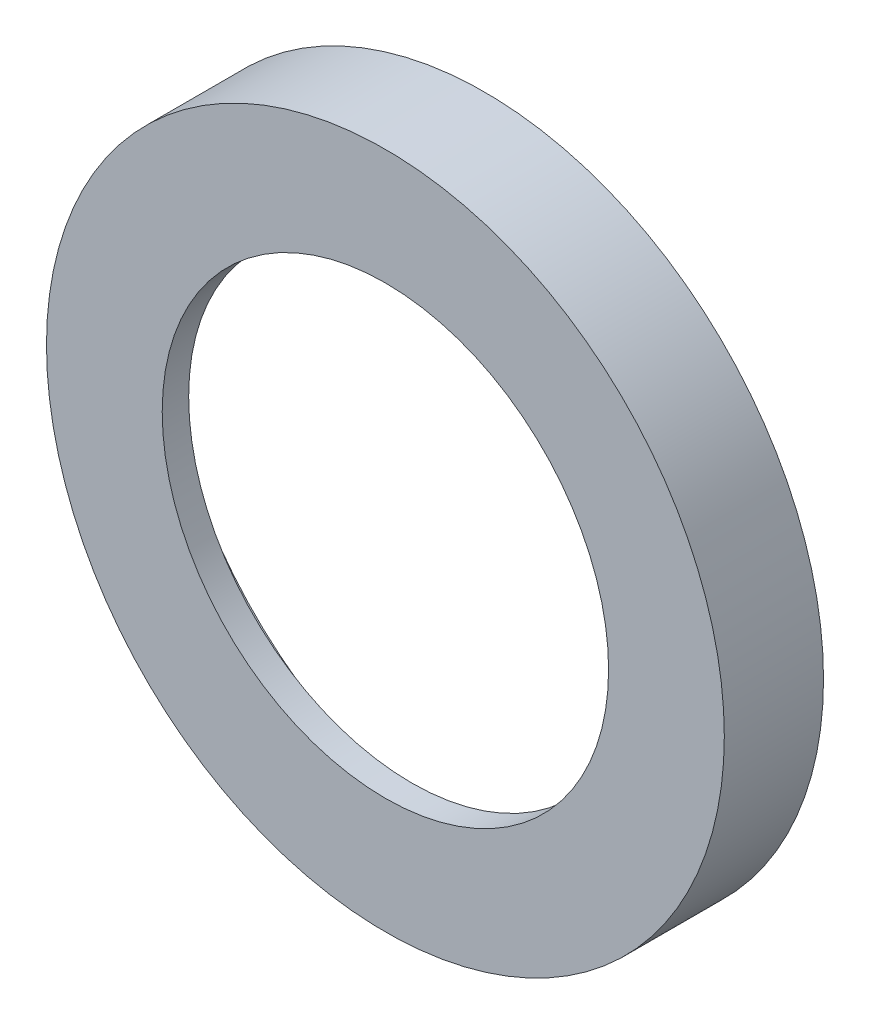
ISO-10303-21;
HEADER;
FILE_DESCRIPTION(('STEP AP214'),'2;1');
FILE_NAME('part.step','',(''),(''),'','','');
FILE_SCHEMA(('AUTOMOTIVE_DESIGN { 1 0 10303 214 1 1 1 1 }'));
ENDSEC;
DATA;
#1=APPLICATION_CONTEXT('core data for automotive mechanical design processes');
#2=APPLICATION_PROTOCOL_DEFINITION('international standard','automotive_design',2000,#1);
#3=PRODUCT_CONTEXT('',#1,'mechanical');
#4=PRODUCT('Part','Part','',(#3));
#5=PRODUCT_RELATED_PRODUCT_CATEGORY('part','',(#4));
#6=PRODUCT_DEFINITION_FORMATION('','',#4);
#7=PRODUCT_DEFINITION_CONTEXT('part definition',#1,'design');
#8=PRODUCT_DEFINITION('design','',#6,#7);
#9=PRODUCT_DEFINITION_SHAPE('','',#8);
#10=(LENGTH_UNIT() NAMED_UNIT(*) SI_UNIT(.MILLI.,.METRE.));
#11=(NAMED_UNIT(*) PLANE_ANGLE_UNIT() SI_UNIT($,.RADIAN.));
#12=(NAMED_UNIT(*) SI_UNIT($,.STERADIAN.) SOLID_ANGLE_UNIT());
#13=UNCERTAINTY_MEASURE_WITH_UNIT(LENGTH_MEASURE(1.E-05),#10,'distance_accuracy_value','');
#14=(GEOMETRIC_REPRESENTATION_CONTEXT(3) GLOBAL_UNCERTAINTY_ASSIGNED_CONTEXT((#13)) GLOBAL_UNIT_ASSIGNED_CONTEXT((#10,
#11,#12)) REPRESENTATION_CONTEXT('',''));
#15=CARTESIAN_POINT('',(0.,0.,0.));
#16=DIRECTION('',(0.,0.,1.));
#17=DIRECTION('',(1.,0.,0.));
#18=AXIS2_PLACEMENT_3D('',#15,#16,#17);
#19=CARTESIAN_POINT('',(0.,0.,3.));
#20=DIRECTION('',(0.,0.,-1.));
#21=DIRECTION('',(-1.,0.,0.));
#22=AXIS2_PLACEMENT_3D('',#19,#20,#21);
#23=CYLINDRICAL_SURFACE('',#22,10.25);
#24=CARTESIAN_POINT('',(0.,0.,3.));
#25=DIRECTION('',(0.,0.,1.));
#26=DIRECTION('',(1.,0.,0.));
#27=AXIS2_PLACEMENT_3D('',#24,#25,#26);
#28=CIRCLE('',#27,10.25);
#29=CARTESIAN_POINT('',(10.25,0.,3.));
#30=VERTEX_POINT('',#29);
#31=EDGE_CURVE('E10',#30,#30,#28,.T.);
#32=ORIENTED_EDGE('',*,*,#31,.F.);
#33=EDGE_LOOP('',(#32));
#34=FACE_BOUND('',#33,.T.);
#35=CARTESIAN_POINT('',(0.,0.,0.));
#36=DIRECTION('',(0.,0.,1.));
#37=DIRECTION('',(1.,0.,0.));
#38=AXIS2_PLACEMENT_3D('',#35,#36,#37);
#39=CIRCLE('',#38,10.25);
#40=CARTESIAN_POINT('',(10.25,0.,0.));
#41=VERTEX_POINT('',#40);
#42=EDGE_CURVE('E38',#41,#41,#39,.T.);
#43=ORIENTED_EDGE('',*,*,#42,.T.);
#44=EDGE_LOOP('',(#43));
#45=FACE_BOUND('',#44,.T.);
#46=ADVANCED_FACE('F35',(#34,#45),#23,.T.);
#47=CARTESIAN_POINT('',(0.,0.,3.));
#48=DIRECTION('',(0.,0.,1.));
#49=DIRECTION('',(1.,0.,0.));
#50=AXIS2_PLACEMENT_3D('',#47,#48,#49);
#51=PLANE('',#50);
#52=CARTESIAN_POINT('',(0.,0.,3.));
#53=DIRECTION('',(0.,0.,-1.));
#54=DIRECTION('',(-1.,0.,0.));
#55=AXIS2_PLACEMENT_3D('',#52,#53,#54);
#56=CIRCLE('',#55,6.75);
#57=CARTESIAN_POINT('',(-6.75,0.,3.));
#58=VERTEX_POINT('',#57);
#59=EDGE_CURVE('E50',#58,#58,#56,.T.);
#60=ORIENTED_EDGE('',*,*,#59,.T.);
#61=EDGE_LOOP('',(#60));
#62=FACE_BOUND('',#61,.T.);
#63=ORIENTED_EDGE('',*,*,#31,.T.);
#64=EDGE_LOOP('',(#63));
#65=FACE_BOUND('',#64,.T.);
#66=ADVANCED_FACE('F59',(#62,#65),#51,.T.);
#67=CARTESIAN_POINT('',(0.,0.,0.));
#68=DIRECTION('',(0.,0.,1.));
#69=DIRECTION('',(1.,0.,0.));
#70=AXIS2_PLACEMENT_3D('',#67,#68,#69);
#71=PLANE('',#70);
#72=CARTESIAN_POINT('',(0.,0.,0.));
#73=DIRECTION('',(0.,0.,-1.));
#74=DIRECTION('',(-1.,0.,0.));
#75=AXIS2_PLACEMENT_3D('',#72,#73,#74);
#76=CIRCLE('',#75,9.8);
#77=CARTESIAN_POINT('',(-9.8,0.,0.));
#78=VERTEX_POINT('',#77);
#79=EDGE_CURVE('E47',#78,#78,#76,.T.);
#80=ORIENTED_EDGE('',*,*,#79,.F.);
#81=EDGE_LOOP('',(#80));
#82=FACE_BOUND('',#81,.T.);
#83=ORIENTED_EDGE('',*,*,#42,.F.);
#84=EDGE_LOOP('',(#83));
#85=FACE_BOUND('',#84,.T.);
#86=ADVANCED_FACE('F76',(#82,#85),#71,.F.);
#87=CARTESIAN_POINT('',(0.,0.,2.2));
#88=DIRECTION('',(0.,0.,-1.));
#89=DIRECTION('',(-1.,0.,0.));
#90=AXIS2_PLACEMENT_3D('',#87,#88,#89);
#91=CYLINDRICAL_SURFACE('',#90,9.8);
#92=CARTESIAN_POINT('',(0.,0.,2.2));
#93=DIRECTION('',(0.,0.,-1.));
#94=DIRECTION('',(-1.,0.,0.));
#95=AXIS2_PLACEMENT_3D('',#92,#93,#94);
#96=CIRCLE('',#95,9.8);
#97=CARTESIAN_POINT('',(-9.8,0.,2.2));
#98=VERTEX_POINT('',#97);
#99=EDGE_CURVE('E45',#98,#98,#96,.T.);
#100=ORIENTED_EDGE('',*,*,#99,.F.);
#101=EDGE_LOOP('',(#100));
#102=FACE_BOUND('',#101,.T.);
#103=ORIENTED_EDGE('',*,*,#79,.T.);
#104=EDGE_LOOP('',(#103));
#105=FACE_BOUND('',#104,.T.);
#106=ADVANCED_FACE('F70',(#102,#105),#91,.F.);
#107=CARTESIAN_POINT('',(0.,0.,2.2));
#108=DIRECTION('',(0.,0.,-1.));
#109=DIRECTION('',(-1.,0.,0.));
#110=AXIS2_PLACEMENT_3D('',#107,#108,#109);
#111=PLANE('',#110);
#112=CARTESIAN_POINT('',(0.,0.,2.2));
#113=DIRECTION('',(0.,0.,-1.));
#114=DIRECTION('',(-1.,0.,0.));
#115=AXIS2_PLACEMENT_3D('',#112,#113,#114);
#116=CIRCLE('',#115,6.75);
#117=CARTESIAN_POINT('',(-6.75,0.,2.2));
#118=VERTEX_POINT('',#117);
#119=EDGE_CURVE('E53',#118,#118,#116,.T.);
#120=ORIENTED_EDGE('',*,*,#119,.F.);
#121=EDGE_LOOP('',(#120));
#122=FACE_BOUND('',#121,.T.);
#123=ORIENTED_EDGE('',*,*,#99,.T.);
#124=EDGE_LOOP('',(#123));
#125=FACE_BOUND('',#124,.T.);
#126=ADVANCED_FACE('F64',(#122,#125),#111,.T.);
#127=CARTESIAN_POINT('',(0.,0.,3.));
#128=DIRECTION('',(0.,0.,-1.));
#129=DIRECTION('',(-1.,0.,0.));
#130=AXIS2_PLACEMENT_3D('',#127,#128,#129);
#131=CYLINDRICAL_SURFACE('',#130,6.75);
#132=CARTESIAN_POINT('',(-6.75,0.,3.));
#133=CARTESIAN_POINT('',(-6.75,0.,2.99166666666667));
#134=CARTESIAN_POINT('',(-6.75,0.,2.98333333333333));
#135=CARTESIAN_POINT('',(-6.75,0.,2.96666666666667));
#136=CARTESIAN_POINT('',(-6.75,0.,2.95833333333333));
#137=CARTESIAN_POINT('',(-6.75,0.,2.94166666666667));
#138=CARTESIAN_POINT('',(-6.75,0.,2.93333333333333));
#139=CARTESIAN_POINT('',(-6.75,0.,2.91666666666667));
#140=CARTESIAN_POINT('',(-6.75,0.,2.90833333333333));
#141=CARTESIAN_POINT('',(-6.75,0.,2.89166666666667));
#142=CARTESIAN_POINT('',(-6.75,0.,2.88333333333333));
#143=CARTESIAN_POINT('',(-6.75,0.,2.86666666666667));
#144=CARTESIAN_POINT('',(-6.75,0.,2.85833333333333));
#145=CARTESIAN_POINT('',(-6.75,0.,2.84166666666667));
#146=CARTESIAN_POINT('',(-6.75,0.,2.83333333333333));
#147=CARTESIAN_POINT('',(-6.75,0.,2.81666666666667));
#148=CARTESIAN_POINT('',(-6.75,0.,2.80833333333333));
#149=CARTESIAN_POINT('',(-6.75,0.,2.79166666666667));
#150=CARTESIAN_POINT('',(-6.75,0.,2.78333333333333));
#151=CARTESIAN_POINT('',(-6.75,0.,2.76666666666667));
#152=CARTESIAN_POINT('',(-6.75,0.,2.75833333333333));
#153=CARTESIAN_POINT('',(-6.75,0.,2.74166666666667));
#154=CARTESIAN_POINT('',(-6.75,0.,2.73333333333333));
#155=CARTESIAN_POINT('',(-6.75,0.,2.71666666666667));
#156=CARTESIAN_POINT('',(-6.75,0.,2.70833333333333));
#157=CARTESIAN_POINT('',(-6.75,0.,2.69166666666667));
#158=CARTESIAN_POINT('',(-6.75,0.,2.68333333333333));
#159=CARTESIAN_POINT('',(-6.75,0.,2.66666666666667));
#160=CARTESIAN_POINT('',(-6.75,0.,2.65833333333333));
#161=CARTESIAN_POINT('',(-6.75,0.,2.64166666666667));
#162=CARTESIAN_POINT('',(-6.75,0.,2.63333333333333));
#163=CARTESIAN_POINT('',(-6.75,0.,2.61666666666667));
#164=CARTESIAN_POINT('',(-6.75,0.,2.60833333333333));
#165=CARTESIAN_POINT('',(-6.75,0.,2.59166666666667));
#166=CARTESIAN_POINT('',(-6.75,0.,2.58333333333333));
#167=CARTESIAN_POINT('',(-6.75,0.,2.56666666666667));
#168=CARTESIAN_POINT('',(-6.75,0.,2.55833333333333));
#169=CARTESIAN_POINT('',(-6.75,0.,2.54166666666667));
#170=CARTESIAN_POINT('',(-6.75,0.,2.53333333333333));
#171=CARTESIAN_POINT('',(-6.75,0.,2.51666666666667));
#172=CARTESIAN_POINT('',(-6.75,0.,2.50833333333333));
#173=CARTESIAN_POINT('',(-6.75,0.,2.49166666666667));
#174=CARTESIAN_POINT('',(-6.75,0.,2.48333333333333));
#175=CARTESIAN_POINT('',(-6.75,0.,2.46666666666667));
#176=CARTESIAN_POINT('',(-6.75,0.,2.45833333333333));
#177=CARTESIAN_POINT('',(-6.75,0.,2.44166666666667));
#178=CARTESIAN_POINT('',(-6.75,0.,2.43333333333333));
#179=CARTESIAN_POINT('',(-6.75,0.,2.41666666666667));
#180=CARTESIAN_POINT('',(-6.75,0.,2.40833333333333));
#181=CARTESIAN_POINT('',(-6.75,0.,2.39166666666667));
#182=CARTESIAN_POINT('',(-6.75,0.,2.38333333333333));
#183=CARTESIAN_POINT('',(-6.75,0.,2.36666666666667));
#184=CARTESIAN_POINT('',(-6.75,0.,2.35833333333333));
#185=CARTESIAN_POINT('',(-6.75,0.,2.34166666666667));
#186=CARTESIAN_POINT('',(-6.75,0.,2.33333333333333));
#187=CARTESIAN_POINT('',(-6.75,0.,2.31666666666667));
#188=CARTESIAN_POINT('',(-6.75,0.,2.30833333333333));
#189=CARTESIAN_POINT('',(-6.75,0.,2.29166666666667));
#190=CARTESIAN_POINT('',(-6.75,0.,2.28333333333333));
#191=CARTESIAN_POINT('',(-6.75,0.,2.26666666666667));
#192=CARTESIAN_POINT('',(-6.75,0.,2.25833333333333));
#193=CARTESIAN_POINT('',(-6.75,0.,2.24166666666667));
#194=CARTESIAN_POINT('',(-6.75,0.,2.23333333333333));
#195=CARTESIAN_POINT('',(-6.75,0.,2.21666666666667));
#196=CARTESIAN_POINT('',(-6.75,0.,2.20833333333333));
#197=CARTESIAN_POINT('',(-6.75,0.,2.2));
#198=B_SPLINE_CURVE_WITH_KNOTS('',3,(#132,#133,#134,#135,#136,#137,#138,#139,#140,#141,#142,
#143,#144,#145,#146,#147,#148,#149,#150,#151,#152,#153,#154,#155,#156,#157,#158,#159,#160,#161,
#162,#163,#164,#165,#166,#167,#168,#169,#170,#171,#172,#173,#174,#175,#176,#177,#178,#179,#180,
#181,#182,#183,#184,#185,#186,#187,#188,#189,#190,#191,#192,#193,#194,#195,#196,#197),
.UNSPECIFIED.,.F.,.F.,(4,2,2,2,2,2,2,2,2,2,2,2,2,2,2,2,2,2,2,2,2,2,2,2,2,2,2,2,2,2,2,2,4),(0.,
0.0249999999999998,0.0499999999999997,0.075,0.0999999999999998,0.125,0.15,0.175,0.2,0.225,0.25,
0.275,0.3,0.325,0.35,0.375,0.4,0.425,0.45,0.475,0.5,0.525,0.55,0.575,0.6,0.625,0.65,0.675,0.7,
0.725,0.75,0.775,0.8),.UNSPECIFIED.);
#199=EDGE_CURVE('BSEAM61',#58,#118,#198,.T.);
#200=ORIENTED_EDGE('',*,*,#59,.F.);
#201=ORIENTED_EDGE('',*,*,#119,.T.);
#202=ORIENTED_EDGE('',*,*,#199,.T.);
#203=ORIENTED_EDGE('',*,*,#199,.F.);
#204=EDGE_LOOP('',(#200,#202,#201,#203));
#205=FACE_BOUND('',#204,.T.);
#206=ADVANCED_FACE('F61',(#205),#131,.F.);
#207=CLOSED_SHELL('',(#46,#66,#86,#106,#126,#206));
#208=MANIFOLD_SOLID_BREP('B2',#207);
#209=ADVANCED_BREP_SHAPE_REPRESENTATION('',(#18,#208),#14);
#210=SHAPE_DEFINITION_REPRESENTATION(#9,#209);
ENDSEC;
END-ISO-10303-21;
